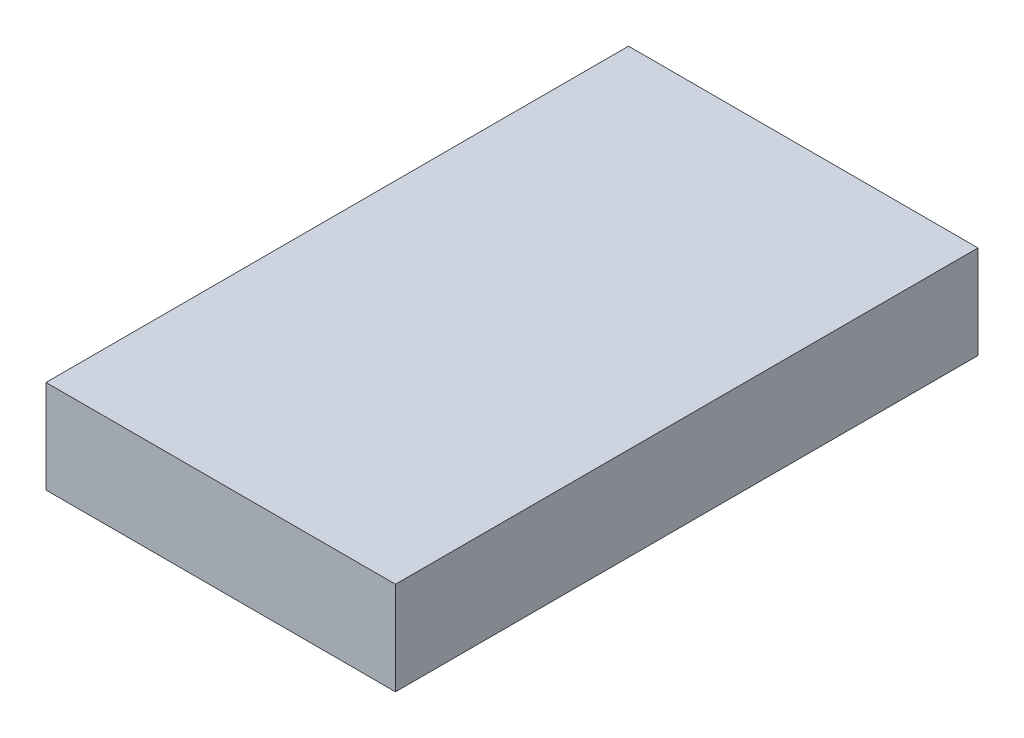
ISO-10303-21;
HEADER;
FILE_DESCRIPTION(('STEP AP214'),'2;1');
FILE_NAME('part.step','',(''),(''),'','','');
FILE_SCHEMA(('AUTOMOTIVE_DESIGN { 1 0 10303 214 1 1 1 1 }'));
ENDSEC;
DATA;
#1=APPLICATION_CONTEXT('core data for automotive mechanical design processes');
#2=APPLICATION_PROTOCOL_DEFINITION('international standard','automotive_design',2000,#1);
#3=PRODUCT_CONTEXT('',#1,'mechanical');
#4=PRODUCT('Part','Part','',(#3));
#5=PRODUCT_RELATED_PRODUCT_CATEGORY('part','',(#4));
#6=PRODUCT_DEFINITION_FORMATION('','',#4);
#7=PRODUCT_DEFINITION_CONTEXT('part definition',#1,'design');
#8=PRODUCT_DEFINITION('design','',#6,#7);
#9=PRODUCT_DEFINITION_SHAPE('','',#8);
#10=(LENGTH_UNIT() NAMED_UNIT(*) SI_UNIT(.MILLI.,.METRE.));
#11=(NAMED_UNIT(*) PLANE_ANGLE_UNIT() SI_UNIT($,.RADIAN.));
#12=(NAMED_UNIT(*) SI_UNIT($,.STERADIAN.) SOLID_ANGLE_UNIT());
#13=UNCERTAINTY_MEASURE_WITH_UNIT(LENGTH_MEASURE(1.E-05),#10,'distance_accuracy_value','');
#14=(GEOMETRIC_REPRESENTATION_CONTEXT(3) GLOBAL_UNCERTAINTY_ASSIGNED_CONTEXT((#13)) GLOBAL_UNIT_ASSIGNED_CONTEXT((#10,
#11,#12)) REPRESENTATION_CONTEXT('',''));
#15=CARTESIAN_POINT('',(0.,0.,0.));
#16=DIRECTION('',(0.,0.,1.));
#17=DIRECTION('',(1.,0.,0.));
#18=AXIS2_PLACEMENT_3D('',#15,#16,#17);
#19=CARTESIAN_POINT('',(0.,4.105,0.));
#20=DIRECTION('',(0.,1.,0.));
#21=DIRECTION('',(1.,0.,0.));
#22=AXIS2_PLACEMENT_3D('',#19,#20,#21);
#23=PLANE('',#22);
#24=DIRECTION('',(-1.,0.,0.));
#25=VECTOR('',#24,1.);
#26=CARTESIAN_POINT('',(0.,4.105,1.19));
#27=LINE('',#26,#25);
#28=CARTESIAN_POINT('',(-4.44,4.105,1.19));
#29=VERTEX_POINT('',#28);
#30=CARTESIAN_POINT('',(-7.44,4.105,1.19));
#31=VERTEX_POINT('',#30);
#32=EDGE_CURVE('E11',#29,#31,#27,.T.);
#33=ORIENTED_EDGE('',*,*,#32,.T.);
#34=DIRECTION('',(0.,0.,1.));
#35=VECTOR('',#34,1.);
#36=CARTESIAN_POINT('',(-7.44,4.105,0.));
#37=LINE('',#36,#35);
#38=CARTESIAN_POINT('',(-7.44,4.105,6.19));
#39=VERTEX_POINT('',#38);
#40=EDGE_CURVE('E24',#31,#39,#37,.T.);
#41=ORIENTED_EDGE('',*,*,#40,.T.);
#42=DIRECTION('',(1.,0.,0.));
#43=VECTOR('',#42,1.);
#44=CARTESIAN_POINT('',(0.,4.105,6.19));
#45=LINE('',#44,#43);
#46=CARTESIAN_POINT('',(-4.44,4.105,6.19));
#47=VERTEX_POINT('',#46);
#48=EDGE_CURVE('E88',#39,#47,#45,.T.);
#49=ORIENTED_EDGE('',*,*,#48,.T.);
#50=DIRECTION('',(0.,0.,-1.));
#51=VECTOR('',#50,1.);
#52=CARTESIAN_POINT('',(-4.44,4.105,0.));
#53=LINE('',#52,#51);
#54=EDGE_CURVE('E59',#47,#29,#53,.T.);
#55=ORIENTED_EDGE('',*,*,#54,.T.);
#56=EDGE_LOOP('',(#33,#41,#49,#55));
#57=FACE_BOUND('',#56,.T.);
#58=ADVANCED_FACE('F17',(#57),#23,.T.);
#59=CARTESIAN_POINT('',(-7.44,4.105,1.19));
#60=DIRECTION('',(1.,0.,0.));
#61=DIRECTION('',(0.,1.,0.));
#62=AXIS2_PLACEMENT_3D('',#59,#60,#61);
#63=PLANE('',#62);
#64=DIRECTION('',(0.,-1.,0.));
#65=VECTOR('',#64,1.);
#66=CARTESIAN_POINT('',(-7.44,4.105,6.19));
#67=LINE('',#66,#65);
#68=CARTESIAN_POINT('',(-7.44,3.305,6.19));
#69=VERTEX_POINT('',#68);
#70=EDGE_CURVE('E75',#39,#69,#67,.T.);
#71=ORIENTED_EDGE('',*,*,#70,.F.);
#72=ORIENTED_EDGE('',*,*,#40,.F.);
#73=DIRECTION('',(0.,1.,0.));
#74=VECTOR('',#73,1.);
#75=CARTESIAN_POINT('',(-7.44,4.105,1.19));
#76=LINE('',#75,#74);
#77=CARTESIAN_POINT('',(-7.44,3.305,1.19));
#78=VERTEX_POINT('',#77);
#79=EDGE_CURVE('E84',#78,#31,#76,.T.);
#80=ORIENTED_EDGE('',*,*,#79,.F.);
#81=DIRECTION('',(0.,0.,-1.));
#82=VECTOR('',#81,1.);
#83=CARTESIAN_POINT('',(-7.44,3.305,1.19));
#84=LINE('',#83,#82);
#85=EDGE_CURVE('E82',#69,#78,#84,.T.);
#86=ORIENTED_EDGE('',*,*,#85,.F.);
#87=EDGE_LOOP('',(#71,#72,#80,#86));
#88=FACE_BOUND('',#87,.T.);
#89=ADVANCED_FACE('F90',(#88),#63,.F.);
#90=CARTESIAN_POINT('',(-4.44,4.105,1.19));
#91=DIRECTION('',(0.,0.,1.));
#92=DIRECTION('',(1.,0.,0.));
#93=AXIS2_PLACEMENT_3D('',#90,#91,#92);
#94=PLANE('',#93);
#95=ORIENTED_EDGE('',*,*,#79,.T.);
#96=ORIENTED_EDGE('',*,*,#32,.F.);
#97=DIRECTION('',(0.,1.,0.));
#98=VECTOR('',#97,1.);
#99=CARTESIAN_POINT('',(-4.44,4.105,1.19));
#100=LINE('',#99,#98);
#101=CARTESIAN_POINT('',(-4.44,3.305,1.19));
#102=VERTEX_POINT('',#101);
#103=EDGE_CURVE('E80',#102,#29,#100,.T.);
#104=ORIENTED_EDGE('',*,*,#103,.F.);
#105=DIRECTION('',(1.,0.,0.));
#106=VECTOR('',#105,1.);
#107=CARTESIAN_POINT('',(-4.44,3.305,1.19));
#108=LINE('',#107,#106);
#109=EDGE_CURVE('E63',#78,#102,#108,.T.);
#110=ORIENTED_EDGE('',*,*,#109,.F.);
#111=EDGE_LOOP('',(#95,#96,#104,#110));
#112=FACE_BOUND('',#111,.T.);
#113=ADVANCED_FACE('F91',(#112),#94,.F.);
#114=CARTESIAN_POINT('',(-4.44,4.105,6.19));
#115=DIRECTION('',(-1.,0.,0.));
#116=DIRECTION('',(0.,0.,1.));
#117=AXIS2_PLACEMENT_3D('',#114,#115,#116);
#118=PLANE('',#117);
#119=ORIENTED_EDGE('',*,*,#103,.T.);
#120=ORIENTED_EDGE('',*,*,#54,.F.);
#121=DIRECTION('',(0.,1.,0.));
#122=VECTOR('',#121,1.);
#123=CARTESIAN_POINT('',(-4.44,4.105,6.19));
#124=LINE('',#123,#122);
#125=CARTESIAN_POINT('',(-4.44,3.305,6.19));
#126=VERTEX_POINT('',#125);
#127=EDGE_CURVE('E54',#126,#47,#124,.T.);
#128=ORIENTED_EDGE('',*,*,#127,.F.);
#129=DIRECTION('',(0.,0.,1.));
#130=VECTOR('',#129,1.);
#131=CARTESIAN_POINT('',(-4.44,3.305,6.19));
#132=LINE('',#131,#130);
#133=EDGE_CURVE('E58',#102,#126,#132,.T.);
#134=ORIENTED_EDGE('',*,*,#133,.F.);
#135=EDGE_LOOP('',(#119,#120,#128,#134));
#136=FACE_BOUND('',#135,.T.);
#137=ADVANCED_FACE('F57',(#136),#118,.F.);
#138=CARTESIAN_POINT('',(-7.44,4.105,6.19));
#139=DIRECTION('',(0.,0.,-1.));
#140=DIRECTION('',(0.,-1.,0.));
#141=AXIS2_PLACEMENT_3D('',#138,#139,#140);
#142=PLANE('',#141);
#143=ORIENTED_EDGE('',*,*,#127,.T.);
#144=ORIENTED_EDGE('',*,*,#48,.F.);
#145=ORIENTED_EDGE('',*,*,#70,.T.);
#146=DIRECTION('',(-1.,0.,0.));
#147=VECTOR('',#146,1.);
#148=CARTESIAN_POINT('',(-7.44,3.305,6.19));
#149=LINE('',#148,#147);
#150=EDGE_CURVE('E70',#126,#69,#149,.T.);
#151=ORIENTED_EDGE('',*,*,#150,.F.);
#152=EDGE_LOOP('',(#143,#144,#145,#151));
#153=FACE_BOUND('',#152,.T.);
#154=ADVANCED_FACE('F73',(#153),#142,.F.);
#155=CARTESIAN_POINT('',(0.,3.305,0.));
#156=DIRECTION('',(0.,1.,0.));
#157=DIRECTION('',(1.,0.,0.));
#158=AXIS2_PLACEMENT_3D('',#155,#156,#157);
#159=PLANE('',#158);
#160=ORIENTED_EDGE('',*,*,#85,.T.);
#161=ORIENTED_EDGE('',*,*,#109,.T.);
#162=ORIENTED_EDGE('',*,*,#133,.T.);
#163=ORIENTED_EDGE('',*,*,#150,.T.);
#164=EDGE_LOOP('',(#160,#161,#162,#163));
#165=FACE_BOUND('',#164,.T.);
#166=ADVANCED_FACE('F69',(#165),#159,.F.);
#167=CLOSED_SHELL('',(#58,#89,#113,#137,#154,#166));
#168=MANIFOLD_SOLID_BREP('B1',#167);
#169=ADVANCED_BREP_SHAPE_REPRESENTATION('',(#18,#168),#14);
#170=SHAPE_DEFINITION_REPRESENTATION(#9,#169);
ENDSEC;
END-ISO-10303-21;
